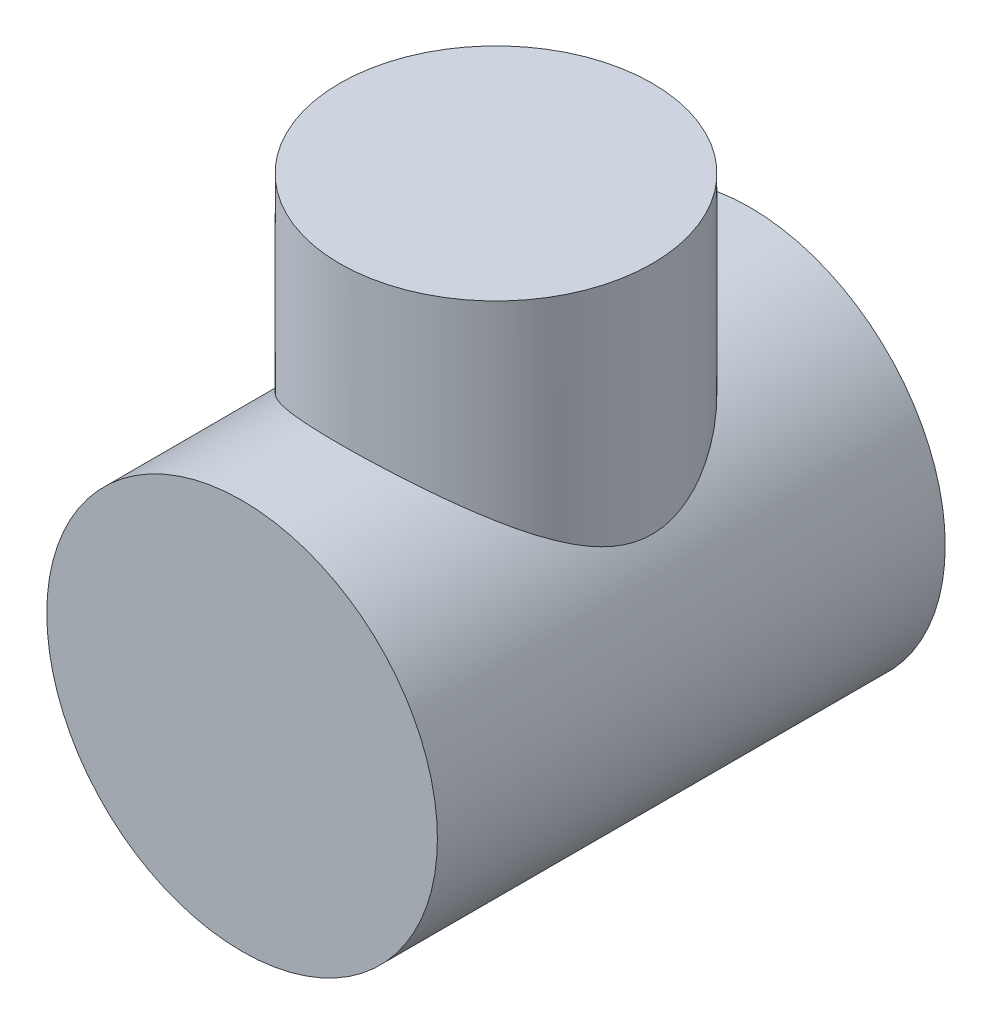
ISO-10303-21;
HEADER;
FILE_DESCRIPTION(('STEP AP214'),'2;1');
FILE_NAME('part.step','',(''),(''),'','','');
FILE_SCHEMA(('AUTOMOTIVE_DESIGN { 1 0 10303 214 1 1 1 1 }'));
ENDSEC;
DATA;
#1=APPLICATION_CONTEXT('core data for automotive mechanical design processes');
#2=APPLICATION_PROTOCOL_DEFINITION('international standard','automotive_design',2000,#1);
#3=PRODUCT_CONTEXT('',#1,'mechanical');
#4=PRODUCT('Part','Part','',(#3));
#5=PRODUCT_RELATED_PRODUCT_CATEGORY('part','',(#4));
#6=PRODUCT_DEFINITION_FORMATION('','',#4);
#7=PRODUCT_DEFINITION_CONTEXT('part definition',#1,'design');
#8=PRODUCT_DEFINITION('design','',#6,#7);
#9=PRODUCT_DEFINITION_SHAPE('','',#8);
#10=(LENGTH_UNIT() NAMED_UNIT(*) SI_UNIT(.MILLI.,.METRE.));
#11=(NAMED_UNIT(*) PLANE_ANGLE_UNIT() SI_UNIT($,.RADIAN.));
#12=(NAMED_UNIT(*) SI_UNIT($,.STERADIAN.) SOLID_ANGLE_UNIT());
#13=UNCERTAINTY_MEASURE_WITH_UNIT(LENGTH_MEASURE(1.E-05),#10,'distance_accuracy_value','');
#14=(GEOMETRIC_REPRESENTATION_CONTEXT(3) GLOBAL_UNCERTAINTY_ASSIGNED_CONTEXT((#13)) GLOBAL_UNIT_ASSIGNED_CONTEXT((#10,
#11,#12)) REPRESENTATION_CONTEXT('',''));
#15=CARTESIAN_POINT('',(0.,0.,0.));
#16=DIRECTION('',(0.,0.,1.));
#17=DIRECTION('',(1.,0.,0.));
#18=AXIS2_PLACEMENT_3D('',#15,#16,#17);
#19=CARTESIAN_POINT('',(0.,4.5,0.));
#20=DIRECTION('',(0.,-1.,0.));
#21=DIRECTION('',(0.,0.,-1.));
#22=AXIS2_PLACEMENT_3D('',#19,#20,#21);
#23=CYLINDRICAL_SURFACE('',#22,2.);
#24=CARTESIAN_POINT('',(0.,4.5,0.));
#25=DIRECTION('',(0.,1.,0.));
#26=DIRECTION('',(0.,0.,1.));
#27=AXIS2_PLACEMENT_3D('',#24,#25,#26);
#28=CIRCLE('',#27,2.);
#29=CARTESIAN_POINT('',(0.,4.5,2.));
#30=VERTEX_POINT('',#29);
#31=EDGE_CURVE('E46',#30,#30,#28,.T.);
#32=ORIENTED_EDGE('',*,*,#31,.F.);
#33=EDGE_LOOP('',(#32));
#34=FACE_BOUND('',#33,.T.);
#35=CARTESIAN_POINT('',(0.,2.5,-2.));
#36=CARTESIAN_POINT('',(0.0959968964388693,2.49999264947401,-1.99999242056707));
#37=CARTESIAN_POINT('',(0.192133192964674,2.49441368411908,-1.99303057133644));
#38=CARTESIAN_POINT('',(0.381319365477408,2.47259269360604,-1.96565005995827));
#39=CARTESIAN_POINT('',(0.474361934321336,2.45632708000382,-1.94520162873807));
#40=CARTESIAN_POINT('',(0.654094916824507,2.4146672181517,-1.89232172110493));
#41=CARTESIAN_POINT('',(0.740821698128048,2.38933120144167,-1.85996664856862));
#42=CARTESIAN_POINT('',(0.906926323692543,2.33136010996601,-1.78488265652265));
#43=CARTESIAN_POINT('',(0.986304144671505,2.29872501207752,-1.74215370414941));
#44=CARTESIAN_POINT('',(1.16318123656703,2.21575664728952,-1.63137163496894));
#45=CARTESIAN_POINT('',(1.25736767952115,2.16321748603216,-1.55968108482594));
#46=CARTESIAN_POINT('',(1.43041367827883,2.05292192603027,-1.4027219342605));
#47=CARTESIAN_POINT('',(1.50922761533153,1.99515072200505,-1.31741424649663));
#48=CARTESIAN_POINT('',(1.6521591895554,1.87856001629835,-1.13322601592733));
#49=CARTESIAN_POINT('',(1.71602638457222,1.81973830902028,-1.03415322702388));
#50=CARTESIAN_POINT('',(1.82646834413604,1.7088210988299,-0.823461217495809));
#51=CARTESIAN_POINT('',(1.87310099386401,1.65670347089169,-0.711885666112006));
#52=CARTESIAN_POINT('',(1.93086043771819,1.58835652300928,-0.526121048323017));
#53=CARTESIAN_POINT('',(1.94865475820658,1.56628727770189,-0.456188262019707));
#54=CARTESIAN_POINT('',(1.97673396798331,1.53069889155832,-0.312787315879533));
#55=CARTESIAN_POINT('',(1.98703731881776,1.5171587417974,-0.239328326475005));
#56=CARTESIAN_POINT('',(1.99939840142554,1.50084234061103,-0.0898074811289627));
#57=CARTESIAN_POINT('',(2.00138345613423,1.49816096926556,-0.0137285151792059));
#58=CARTESIAN_POINT('',(1.99669481699685,1.50439962302809,0.137704892032744));
#59=CARTESIAN_POINT('',(1.99001379511087,1.51332946660241,0.213058665766297));
#60=CARTESIAN_POINT('',(1.9669530271194,1.5432072129997,0.372222302612729));
#61=CARTESIAN_POINT('',(1.94921808205621,1.56581842049528,0.455508006054002));
#62=CARTESIAN_POINT('',(1.90444547348848,1.61997459936279,0.616535559537034));
#63=CARTESIAN_POINT('',(1.87738025642251,1.65154598198641,0.694260156539822));
#64=CARTESIAN_POINT('',(1.79974102194077,1.73656116159416,0.880662106040976));
#65=CARTESIAN_POINT('',(1.74414886595503,1.79313372968154,0.985802698304186));
#66=CARTESIAN_POINT('',(1.61638467497537,1.90913780060687,1.18371667779933));
#67=CARTESIAN_POINT('',(1.54418846902464,1.96857337048937,1.27647172084354));
#68=CARTESIAN_POINT('',(1.38145818326396,2.08612751968448,1.45127477140507));
#69=CARTESIAN_POINT('',(1.29048701026967,2.14416889260779,1.53297192230577));
#70=CARTESIAN_POINT('',(1.09198491072666,2.25171871494994,1.68009949943431));
#71=CARTESIAN_POINT('',(0.984499645201078,2.3012499182245,1.74557351611723));
#72=CARTESIAN_POINT('',(0.787777814380558,2.37424585643318,1.8405628474099));
#73=CARTESIAN_POINT('',(0.702177727329205,2.40111071224171,1.87500450443907));
#74=CARTESIAN_POINT('',(0.524913923737152,2.44597564111417,1.93212645098797));
#75=CARTESIAN_POINT('',(0.433254836272284,2.46398239496913,1.95481560494548));
#76=CARTESIAN_POINT('',(0.245713233844926,2.48970335685206,1.98713854693579));
#77=CARTESIAN_POINT('',(0.149811307212616,2.49736378633666,1.99670412474496));
#78=CARTESIAN_POINT('',(-0.0426080028675189,2.50148682701864,2.00185904897629));
#79=CARTESIAN_POINT('',(-0.139125268327963,2.49795152409062,1.99745099882206));
#80=CARTESIAN_POINT('',(-0.321746674155463,2.48076858642945,1.97591718375232));
#81=CARTESIAN_POINT('',(-0.408060891756566,2.46796352405063,1.95985082486099));
#82=CARTESIAN_POINT('',(-0.576335674228722,2.43417513213473,1.91712781889844));
#83=CARTESIAN_POINT('',(-0.658294938856941,2.41318937553438,1.89046802890338));
#84=CARTESIAN_POINT('',(-0.82123587754891,2.36289849431328,1.82584962821607));
#85=CARTESIAN_POINT('',(-0.901843619419054,2.33315912736867,1.78729421404364));
#86=CARTESIAN_POINT('',(-1.05541000448331,2.26783622722139,1.70113784836721));
#87=CARTESIAN_POINT('',(-1.12836826593788,2.23225240258423,1.65353644576545));
#88=CARTESIAN_POINT('',(-1.27925237569143,2.14993687522397,1.54077568170313));
#89=CARTESIAN_POINT('',(-1.35550718978129,2.1023696976822,1.473998309517));
#90=CARTESIAN_POINT('',(-1.4965368759753,2.00443497952019,1.33061303862901));
#91=CARTESIAN_POINT('',(-1.56127777727367,1.95405970991097,1.25397716316117));
#92=CARTESIAN_POINT('',(-1.65568487930787,1.87374135317135,1.12356555676341));
#93=CARTESIAN_POINT('',(-1.68913741792652,1.84354743685463,1.07263940924667));
#94=CARTESIAN_POINT('',(-1.75155001920544,1.78435415521131,0.967377738576406));
#95=CARTESIAN_POINT('',(-1.78050769868976,1.75535542951891,0.913040428119205));
#96=CARTESIAN_POINT('',(-1.83358089959817,1.69983828792997,0.801125159718338));
#97=CARTESIAN_POINT('',(-1.85771431687654,1.67331090774834,0.743560232756312));
#98=CARTESIAN_POINT('',(-1.90088481958635,1.62410209867689,0.624991021496015));
#99=CARTESIAN_POINT('',(-1.9199255893155,1.60141789380427,0.563989262480461));
#100=CARTESIAN_POINT('',(-1.95360165889083,1.5601942022258,0.433913275762201));
#101=CARTESIAN_POINT('',(-1.96779559724999,1.54209716714775,0.36457733505965));
#102=CARTESIAN_POINT('',(-1.98878905619367,1.5149337159379,0.223162387261947));
#103=CARTESIAN_POINT('',(-1.99560723074758,1.50584452307525,0.151090779549515));
#104=CARTESIAN_POINT('',(-2.00132058716546,1.49824736779721,0.00565129453592246));
#105=CARTESIAN_POINT('',(-2.00017319779789,1.49979625918437,-0.0677214541541586));
#106=CARTESIAN_POINT('',(-1.98996519544204,1.51330771695992,-0.212984193023103));
#107=CARTESIAN_POINT('',(-1.98089203653787,1.52528679347386,-0.284871647326101));
#108=CARTESIAN_POINT('',(-1.95207745752715,1.56207076756083,-0.444606774344556));
#109=CARTESIAN_POINT('',(-1.93009230408642,1.5894925841937,-0.531423082491121));
#110=CARTESIAN_POINT('',(-1.87608177217432,1.65288907642407,-0.698633478689637));
#111=CARTESIAN_POINT('',(-1.84402681542564,1.68888887211293,-0.779007760036715));
#112=CARTESIAN_POINT('',(-1.78094746311468,1.75491158724438,-0.912177722046153));
#113=CARTESIAN_POINT('',(-1.75202363190409,1.78388907325008,-0.96651918151829));
#114=CARTESIAN_POINT('',(-1.68964733782463,1.84307948739002,-1.07183822981726));
#115=CARTESIAN_POINT('',(-1.65619322765903,1.87329286211508,-1.12281458495115));
#116=CARTESIAN_POINT('',(-1.54918435570711,1.96437997758119,-1.27077940329882));
#117=CARTESIAN_POINT('',(-1.4689854164051,2.02569808481402,-1.36279868666247));
#118=CARTESIAN_POINT('',(-1.29001718858431,2.14418278787112,-1.53338946483076));
#119=CARTESIAN_POINT('',(-1.19101966157649,2.201284919641,-1.61177022423679));
#120=CARTESIAN_POINT('',(-1.02998399899547,2.27874650804527,-1.71557672941679));
#121=CARTESIAN_POINT('',(-0.974255400199698,2.30318868109328,-1.74786844413512));
#122=CARTESIAN_POINT('',(-0.858854828628047,2.34866115465602,-1.80736810096138));
#123=CARTESIAN_POINT('',(-0.799185299805365,2.36969354228912,-1.83457915448451));
#124=CARTESIAN_POINT('',(-0.655037739424249,2.41420905511499,-1.89178005989561));
#125=CARTESIAN_POINT('',(-0.569110239590121,2.43602892887628,-1.91948267180093));
#126=CARTESIAN_POINT('',(-0.392713097427723,2.47058864976841,-1.9631576733877));
#127=CARTESIAN_POINT('',(-0.302256024103139,2.48335227816872,-1.97916078877459));
#128=CARTESIAN_POINT('',(-0.175880930919912,2.49405378309104,-1.9925630255603));
#129=CARTESIAN_POINT('',(-0.140808552821273,2.49627918763429,-1.99534737874577));
#130=CARTESIAN_POINT('',(-0.0704970748918278,2.499253810179,-1.99906746352746));
#131=CARTESIAN_POINT('',(-0.0352579397117341,2.50000269971647,-2.00000278378988));
#132=CARTESIAN_POINT('',(0.,2.5,-2.));
#133=B_SPLINE_CURVE_WITH_KNOTS('',3,(#35,#36,#37,#38,#39,#40,#41,#42,#43,#44,#45,#46,#47,#48,
#49,#50,#51,#52,#53,#54,#55,#56,#57,#58,#59,#60,#61,#62,#63,#64,#65,#66,#67,#68,#69,#70,#71,#72,
#73,#74,#75,#76,#77,#78,#79,#80,#81,#82,#83,#84,#85,#86,#87,#88,#89,#90,#91,#92,#93,#94,#95,#96,
#97,#98,#99,#100,#101,#102,#103,#104,#105,#106,#107,#108,#109,#110,#111,#112,#113,#114,#115,
#116,#117,#118,#119,#120,#121,#122,#123,#124,#125,#126,#127,#128,#129,#130,#131,#132),
.UNSPECIFIED.,.T.,.F.,(4,2,2,2,2,2,2,2,2,2,2,2,2,2,2,2,2,2,2,2,2,2,2,2,2,2,2,2,2,2,2,2,2,2,2,2,
2,2,2,2,2,2,2,2,2,2,2,2,4),(0.,0.287836605992209,0.576310692639342,0.862965057250605,
1.14962032997081,1.53607888200101,1.92366738187851,2.31734741765481,2.70969292925127,
2.9353448634113,3.1604387740811,3.38749528500759,3.61474392028823,3.8775863003201,
4.14121163495705,4.53425748188301,4.92787915886674,5.33198173288419,5.73498644040676,
6.02213978124802,6.30907621738868,6.59749843639964,6.88586692268771,7.15087004938159,
7.41595185759573,7.69742753051566,7.97891724351349,8.31365537249325,8.64936529970902,
8.85316560745906,9.05707360380851,9.26021055202078,9.46320013996581,9.68152133432596,
9.89928907450684,10.1182215471168,10.3375012031536,10.616933053181,10.8971934831173,
11.1010640012511,11.3050088506911,11.7129165318148,12.1261363563906,12.3324811048119,
12.5386990694968,12.8161540735934,13.0928777702216,13.1985714874516,13.3042887145431),.UNSPECIFIED.);
#134=CARTESIAN_POINT('',(0.,2.5,-2.));
#135=VERTEX_POINT('',#134);
#136=EDGE_CURVE('E10',#135,#135,#133,.T.);
#137=ORIENTED_EDGE('',*,*,#136,.F.);
#138=EDGE_LOOP('',(#137));
#139=FACE_BOUND('',#138,.T.);
#140=ADVANCED_FACE('F35',(#34,#139),#23,.T.);
#141=CARTESIAN_POINT('',(0.,4.5,0.));
#142=DIRECTION('',(0.,1.,0.));
#143=DIRECTION('',(0.,0.,1.));
#144=AXIS2_PLACEMENT_3D('',#141,#142,#143);
#145=PLANE('',#144);
#146=ORIENTED_EDGE('',*,*,#31,.T.);
#147=EDGE_LOOP('',(#146));
#148=FACE_BOUND('',#147,.T.);
#149=ADVANCED_FACE('F73',(#148),#145,.T.);
#150=CARTESIAN_POINT('',(0.,0.,3.25));
#151=DIRECTION('',(0.,0.,-1.));
#152=DIRECTION('',(-1.,0.,0.));
#153=AXIS2_PLACEMENT_3D('',#150,#151,#152);
#154=CYLINDRICAL_SURFACE('',#153,2.5);
#155=CARTESIAN_POINT('',(0.,0.,-3.25));
#156=DIRECTION('',(0.,0.,1.));
#157=DIRECTION('',(1.,0.,0.));
#158=AXIS2_PLACEMENT_3D('',#155,#156,#157);
#159=CIRCLE('',#158,2.5);
#160=CARTESIAN_POINT('',(2.5,0.,-3.25));
#161=VERTEX_POINT('',#160);
#162=EDGE_CURVE('E54',#161,#161,#159,.T.);
#163=ORIENTED_EDGE('',*,*,#162,.T.);
#164=EDGE_LOOP('',(#163));
#165=FACE_BOUND('',#164,.T.);
#166=CARTESIAN_POINT('',(0.,0.,3.25));
#167=DIRECTION('',(0.,0.,1.));
#168=DIRECTION('',(1.,0.,0.));
#169=AXIS2_PLACEMENT_3D('',#166,#167,#168);
#170=CIRCLE('',#169,2.5);
#171=CARTESIAN_POINT('',(2.5,0.,3.25));
#172=VERTEX_POINT('',#171);
#173=EDGE_CURVE('E50',#172,#172,#170,.T.);
#174=ORIENTED_EDGE('',*,*,#173,.F.);
#175=EDGE_LOOP('',(#174));
#176=FACE_BOUND('',#175,.T.);
#177=ORIENTED_EDGE('',*,*,#136,.T.);
#178=EDGE_LOOP('',(#177));
#179=FACE_BOUND('',#178,.T.);
#180=ADVANCED_FACE('F60',(#165,#176,#179),#154,.T.);
#181=CARTESIAN_POINT('',(0.,0.,3.25));
#182=DIRECTION('',(0.,0.,1.));
#183=DIRECTION('',(1.,0.,0.));
#184=AXIS2_PLACEMENT_3D('',#181,#182,#183);
#185=PLANE('',#184);
#186=ORIENTED_EDGE('',*,*,#173,.T.);
#187=EDGE_LOOP('',(#186));
#188=FACE_BOUND('',#187,.T.);
#189=ADVANCED_FACE('F65',(#188),#185,.T.);
#190=CARTESIAN_POINT('',(0.,0.,-3.25));
#191=DIRECTION('',(0.,0.,1.));
#192=DIRECTION('',(1.,0.,0.));
#193=AXIS2_PLACEMENT_3D('',#190,#191,#192);
#194=PLANE('',#193);
#195=ORIENTED_EDGE('',*,*,#162,.F.);
#196=EDGE_LOOP('',(#195));
#197=FACE_BOUND('',#196,.T.);
#198=ADVANCED_FACE('F63',(#197),#194,.F.);
#199=CLOSED_SHELL('',(#140,#149,#180,#189,#198));
#200=MANIFOLD_SOLID_BREP('B2',#199);
#201=ADVANCED_BREP_SHAPE_REPRESENTATION('',(#18,#200),#14);
#202=SHAPE_DEFINITION_REPRESENTATION(#9,#201);
ENDSEC;
END-ISO-10303-21;
